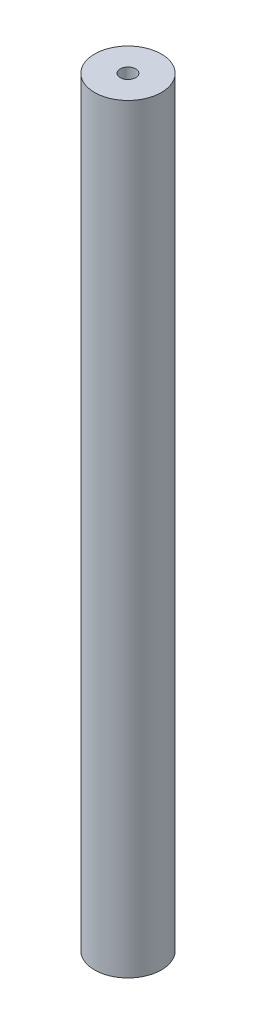
ISO-10303-21;
HEADER;
FILE_DESCRIPTION(('STEP AP214'),'2;1');
FILE_NAME('part.step','',(''),(''),'','','');
FILE_SCHEMA(('AUTOMOTIVE_DESIGN { 1 0 10303 214 1 1 1 1 }'));
ENDSEC;
DATA;
#1=APPLICATION_CONTEXT('core data for automotive mechanical design processes');
#2=APPLICATION_PROTOCOL_DEFINITION('international standard','automotive_design',2000,#1);
#3=PRODUCT_CONTEXT('',#1,'mechanical');
#4=PRODUCT('Part','Part','',(#3));
#5=PRODUCT_RELATED_PRODUCT_CATEGORY('part','',(#4));
#6=PRODUCT_DEFINITION_FORMATION('','',#4);
#7=PRODUCT_DEFINITION_CONTEXT('part definition',#1,'design');
#8=PRODUCT_DEFINITION('design','',#6,#7);
#9=PRODUCT_DEFINITION_SHAPE('','',#8);
#10=(LENGTH_UNIT() NAMED_UNIT(*) SI_UNIT(.MILLI.,.METRE.));
#11=(NAMED_UNIT(*) PLANE_ANGLE_UNIT() SI_UNIT($,.RADIAN.));
#12=(NAMED_UNIT(*) SI_UNIT($,.STERADIAN.) SOLID_ANGLE_UNIT());
#13=UNCERTAINTY_MEASURE_WITH_UNIT(LENGTH_MEASURE(1.E-05),#10,'distance_accuracy_value','');
#14=(GEOMETRIC_REPRESENTATION_CONTEXT(3) GLOBAL_UNCERTAINTY_ASSIGNED_CONTEXT((#13)) GLOBAL_UNIT_ASSIGNED_CONTEXT((#10,
#11,#12)) REPRESENTATION_CONTEXT('',''));
#15=CARTESIAN_POINT('',(0.,0.,0.));
#16=DIRECTION('',(0.,0.,1.));
#17=DIRECTION('',(1.,0.,0.));
#18=AXIS2_PLACEMENT_3D('',#15,#16,#17);
#19=CARTESIAN_POINT('',(0.,148.,0.));
#20=DIRECTION('',(0.,-1.,0.));
#21=DIRECTION('',(0.,0.,-1.));
#22=AXIS2_PLACEMENT_3D('',#19,#20,#21);
#23=CYLINDRICAL_SURFACE('',#22,6.5);
#24=CARTESIAN_POINT('',(0.,148.,0.));
#25=DIRECTION('',(0.,1.,0.));
#26=DIRECTION('',(0.,0.,1.));
#27=AXIS2_PLACEMENT_3D('',#24,#25,#26);
#28=CIRCLE('',#27,6.5);
#29=CARTESIAN_POINT('',(0.,148.,6.5));
#30=VERTEX_POINT('',#29);
#31=EDGE_CURVE('E10',#30,#30,#28,.T.);
#32=ORIENTED_EDGE('',*,*,#31,.F.);
#33=EDGE_LOOP('',(#32));
#34=FACE_BOUND('',#33,.T.);
#35=CARTESIAN_POINT('',(0.,0.,0.));
#36=DIRECTION('',(0.,1.,0.));
#37=DIRECTION('',(0.,0.,1.));
#38=AXIS2_PLACEMENT_3D('',#35,#36,#37);
#39=CIRCLE('',#38,6.5);
#40=CARTESIAN_POINT('',(0.,0.,6.5));
#41=VERTEX_POINT('',#40);
#42=EDGE_CURVE('E33',#41,#41,#39,.T.);
#43=ORIENTED_EDGE('',*,*,#42,.T.);
#44=EDGE_LOOP('',(#43));
#45=FACE_BOUND('',#44,.T.);
#46=ADVANCED_FACE('F30',(#34,#45),#23,.T.);
#47=CARTESIAN_POINT('',(0.,148.,0.));
#48=DIRECTION('',(0.,1.,0.));
#49=DIRECTION('',(0.,0.,1.));
#50=AXIS2_PLACEMENT_3D('',#47,#48,#49);
#51=PLANE('',#50);
#52=CARTESIAN_POINT('',(0.,148.,0.));
#53=DIRECTION('',(0.,1.,0.));
#54=DIRECTION('',(0.,0.,1.));
#55=AXIS2_PLACEMENT_3D('',#52,#53,#54);
#56=CIRCLE('',#55,1.5);
#57=CARTESIAN_POINT('',(0.,148.,1.5));
#58=VERTEX_POINT('',#57);
#59=EDGE_CURVE('E42',#58,#58,#56,.T.);
#60=ORIENTED_EDGE('',*,*,#59,.F.);
#61=EDGE_LOOP('',(#60));
#62=FACE_BOUND('',#61,.T.);
#63=ORIENTED_EDGE('',*,*,#31,.T.);
#64=EDGE_LOOP('',(#63));
#65=FACE_BOUND('',#64,.T.);
#66=ADVANCED_FACE('F70',(#62,#65),#51,.T.);
#67=CARTESIAN_POINT('',(0.,0.,0.));
#68=DIRECTION('',(0.,1.,0.));
#69=DIRECTION('',(0.,0.,1.));
#70=AXIS2_PLACEMENT_3D('',#67,#68,#69);
#71=PLANE('',#70);
#72=CARTESIAN_POINT('',(0.,0.,0.));
#73=DIRECTION('',(0.,1.,0.));
#74=DIRECTION('',(0.,0.,1.));
#75=AXIS2_PLACEMENT_3D('',#72,#73,#74);
#76=CIRCLE('',#75,1.5);
#77=CARTESIAN_POINT('',(0.,0.,1.5));
#78=VERTEX_POINT('',#77);
#79=EDGE_CURVE('E45',#78,#78,#76,.T.);
#80=ORIENTED_EDGE('',*,*,#79,.T.);
#81=EDGE_LOOP('',(#80));
#82=FACE_BOUND('',#81,.T.);
#83=ORIENTED_EDGE('',*,*,#42,.F.);
#84=EDGE_LOOP('',(#83));
#85=FACE_BOUND('',#84,.T.);
#86=ADVANCED_FACE('F54',(#82,#85),#71,.F.);
#87=CARTESIAN_POINT('',(0.,143.,0.));
#88=DIRECTION('',(0.,1.,0.));
#89=DIRECTION('',(0.,0.,1.));
#90=AXIS2_PLACEMENT_3D('',#87,#88,#89);
#91=CYLINDRICAL_SURFACE('',#90,1.5);
#92=CARTESIAN_POINT('',(0.,143.,0.));
#93=DIRECTION('',(0.,1.,0.));
#94=DIRECTION('',(0.,0.,1.));
#95=AXIS2_PLACEMENT_3D('',#92,#93,#94);
#96=CIRCLE('',#95,1.5);
#97=CARTESIAN_POINT('',(0.,143.,1.5));
#98=VERTEX_POINT('',#97);
#99=EDGE_CURVE('E40',#98,#98,#96,.T.);
#100=ORIENTED_EDGE('',*,*,#99,.F.);
#101=EDGE_LOOP('',(#100));
#102=FACE_BOUND('',#101,.T.);
#103=ORIENTED_EDGE('',*,*,#59,.T.);
#104=EDGE_LOOP('',(#103));
#105=FACE_BOUND('',#104,.T.);
#106=ADVANCED_FACE('F80',(#102,#105),#91,.F.);
#107=CARTESIAN_POINT('',(0.,143.,0.));
#108=DIRECTION('',(0.,1.,0.));
#109=DIRECTION('',(0.,0.,1.));
#110=AXIS2_PLACEMENT_3D('',#107,#108,#109);
#111=PLANE('',#110);
#112=ORIENTED_EDGE('',*,*,#99,.T.);
#113=EDGE_LOOP('',(#112));
#114=FACE_BOUND('',#113,.T.);
#115=ADVANCED_FACE('F61',(#114),#111,.T.);
#116=CARTESIAN_POINT('',(0.,0.,0.));
#117=DIRECTION('',(0.,1.,0.));
#118=DIRECTION('',(0.,0.,1.));
#119=AXIS2_PLACEMENT_3D('',#116,#117,#118);
#120=CYLINDRICAL_SURFACE('',#119,1.5);
#121=ORIENTED_EDGE('',*,*,#79,.F.);
#122=EDGE_LOOP('',(#121));
#123=FACE_BOUND('',#122,.T.);
#124=CARTESIAN_POINT('',(0.,5.,0.));
#125=DIRECTION('',(0.,1.,0.));
#126=DIRECTION('',(0.,0.,1.));
#127=AXIS2_PLACEMENT_3D('',#124,#125,#126);
#128=CIRCLE('',#127,1.5);
#129=CARTESIAN_POINT('',(0.,5.,1.5));
#130=VERTEX_POINT('',#129);
#131=EDGE_CURVE('E48',#130,#130,#128,.T.);
#132=ORIENTED_EDGE('',*,*,#131,.T.);
#133=EDGE_LOOP('',(#132));
#134=FACE_BOUND('',#133,.T.);
#135=ADVANCED_FACE('F57',(#123,#134),#120,.F.);
#136=CARTESIAN_POINT('',(0.,5.,0.));
#137=DIRECTION('',(0.,1.,0.));
#138=DIRECTION('',(0.,0.,1.));
#139=AXIS2_PLACEMENT_3D('',#136,#137,#138);
#140=PLANE('',#139);
#141=ORIENTED_EDGE('',*,*,#131,.F.);
#142=EDGE_LOOP('',(#141));
#143=FACE_BOUND('',#142,.T.);
#144=ADVANCED_FACE('F60',(#143),#140,.F.);
#145=CLOSED_SHELL('',(#46,#66,#86,#106,#115,#135,#144));
#146=MANIFOLD_SOLID_BREP('B2',#145);
#147=ADVANCED_BREP_SHAPE_REPRESENTATION('',(#18,#146),#14);
#148=SHAPE_DEFINITION_REPRESENTATION(#9,#147);
ENDSEC;
END-ISO-10303-21;
